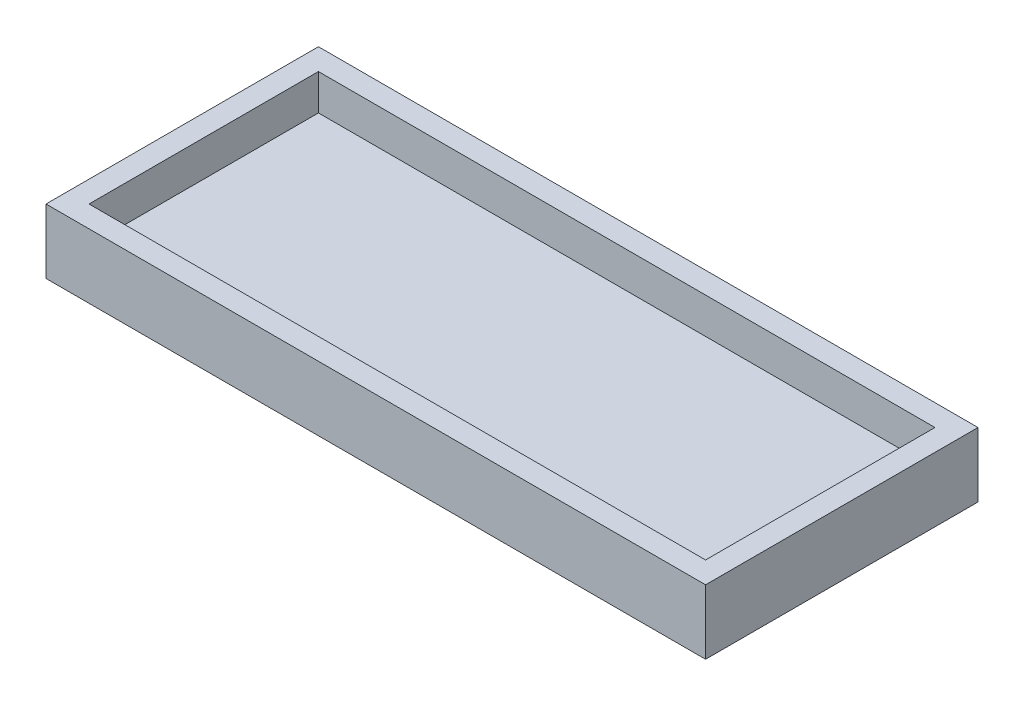
ISO-10303-21;
HEADER;
FILE_DESCRIPTION(('STEP AP214'),'2;1');
FILE_NAME('part.step','',(''),(''),'','','');
FILE_SCHEMA(('AUTOMOTIVE_DESIGN { 1 0 10303 214 1 1 1 1 }'));
ENDSEC;
DATA;
#1=APPLICATION_CONTEXT('core data for automotive mechanical design processes');
#2=APPLICATION_PROTOCOL_DEFINITION('international standard','automotive_design',2000,#1);
#3=PRODUCT_CONTEXT('',#1,'mechanical');
#4=PRODUCT('Part','Part','',(#3));
#5=PRODUCT_RELATED_PRODUCT_CATEGORY('part','',(#4));
#6=PRODUCT_DEFINITION_FORMATION('','',#4);
#7=PRODUCT_DEFINITION_CONTEXT('part definition',#1,'design');
#8=PRODUCT_DEFINITION('design','',#6,#7);
#9=PRODUCT_DEFINITION_SHAPE('','',#8);
#10=(LENGTH_UNIT() NAMED_UNIT(*) SI_UNIT(.MILLI.,.METRE.));
#11=(NAMED_UNIT(*) PLANE_ANGLE_UNIT() SI_UNIT($,.RADIAN.));
#12=(NAMED_UNIT(*) SI_UNIT($,.STERADIAN.) SOLID_ANGLE_UNIT());
#13=UNCERTAINTY_MEASURE_WITH_UNIT(LENGTH_MEASURE(1.E-05),#10,'distance_accuracy_value','');
#14=(GEOMETRIC_REPRESENTATION_CONTEXT(3) GLOBAL_UNCERTAINTY_ASSIGNED_CONTEXT((#13)) GLOBAL_UNIT_ASSIGNED_CONTEXT((#10,
#11,#12)) REPRESENTATION_CONTEXT('',''));
#15=CARTESIAN_POINT('',(0.,0.,0.));
#16=DIRECTION('',(0.,0.,1.));
#17=DIRECTION('',(1.,0.,0.));
#18=AXIS2_PLACEMENT_3D('',#15,#16,#17);
#19=CARTESIAN_POINT('',(0.,2.,0.));
#20=DIRECTION('',(0.,1.,0.));
#21=DIRECTION('',(0.,0.,1.));
#22=AXIS2_PLACEMENT_3D('',#19,#20,#21);
#23=PLANE('',#22);
#24=DIRECTION('',(0.,0.,-1.));
#25=VECTOR('',#24,1.);
#26=CARTESIAN_POINT('',(21.5,2.,-8.));
#27=LINE('',#26,#25);
#28=CARTESIAN_POINT('',(21.5,2.,8.));
#29=VERTEX_POINT('',#28);
#30=CARTESIAN_POINT('',(21.5,2.,-8.));
#31=VERTEX_POINT('',#30);
#32=EDGE_CURVE('E155',#29,#31,#27,.T.);
#33=ORIENTED_EDGE('',*,*,#32,.T.);
#34=DIRECTION('',(-1.,0.,0.));
#35=VECTOR('',#34,1.);
#36=CARTESIAN_POINT('',(-21.5,2.,-8.));
#37=LINE('',#36,#35);
#38=CARTESIAN_POINT('',(-21.5,2.,-8.));
#39=VERTEX_POINT('',#38);
#40=EDGE_CURVE('E102',#31,#39,#37,.T.);
#41=ORIENTED_EDGE('',*,*,#40,.T.);
#42=DIRECTION('',(0.,0.,1.));
#43=VECTOR('',#42,1.);
#44=CARTESIAN_POINT('',(-21.5,2.,-8.));
#45=LINE('',#44,#43);
#46=CARTESIAN_POINT('',(-21.5,2.,8.));
#47=VERTEX_POINT('',#46);
#48=EDGE_CURVE('E41',#39,#47,#45,.T.);
#49=ORIENTED_EDGE('',*,*,#48,.T.);
#50=DIRECTION('',(1.,0.,0.));
#51=VECTOR('',#50,1.);
#52=CARTESIAN_POINT('',(-21.5,2.,8.));
#53=LINE('',#52,#51);
#54=EDGE_CURVE('E11',#47,#29,#53,.T.);
#55=ORIENTED_EDGE('',*,*,#54,.T.);
#56=EDGE_LOOP('',(#33,#41,#49,#55));
#57=FACE_BOUND('',#56,.T.);
#58=ADVANCED_FACE('F33',(#57),#23,.T.);
#59=CARTESIAN_POINT('',(-23.,4.5,-9.5));
#60=DIRECTION('',(0.,0.,-1.));
#61=DIRECTION('',(-1.,0.,0.));
#62=AXIS2_PLACEMENT_3D('',#59,#60,#61);
#63=PLANE('',#62);
#64=DIRECTION('',(1.,0.,0.));
#65=VECTOR('',#64,1.);
#66=CARTESIAN_POINT('',(-23.,0.,-9.5));
#67=LINE('',#66,#65);
#68=CARTESIAN_POINT('',(-23.,0.,-9.5));
#69=VERTEX_POINT('',#68);
#70=CARTESIAN_POINT('',(23.,0.,-9.5));
#71=VERTEX_POINT('',#70);
#72=EDGE_CURVE('E125',#69,#71,#67,.T.);
#73=ORIENTED_EDGE('',*,*,#72,.F.);
#74=DIRECTION('',(0.,-1.,0.));
#75=VECTOR('',#74,1.);
#76=CARTESIAN_POINT('',(-23.,4.5,-9.5));
#77=LINE('',#76,#75);
#78=CARTESIAN_POINT('',(-23.,4.5,-9.5));
#79=VERTEX_POINT('',#78);
#80=EDGE_CURVE('E153',#79,#69,#77,.T.);
#81=ORIENTED_EDGE('',*,*,#80,.F.);
#82=DIRECTION('',(1.,0.,0.));
#83=VECTOR('',#82,1.);
#84=CARTESIAN_POINT('',(-23.,4.5,-9.5));
#85=LINE('',#84,#83);
#86=CARTESIAN_POINT('',(23.,4.5,-9.5));
#87=VERTEX_POINT('',#86);
#88=EDGE_CURVE('E129',#79,#87,#85,.T.);
#89=ORIENTED_EDGE('',*,*,#88,.T.);
#90=DIRECTION('',(0.,-1.,0.));
#91=VECTOR('',#90,1.);
#92=CARTESIAN_POINT('',(23.,4.5,-9.5));
#93=LINE('',#92,#91);
#94=EDGE_CURVE('E142',#87,#71,#93,.T.);
#95=ORIENTED_EDGE('',*,*,#94,.T.);
#96=EDGE_LOOP('',(#73,#81,#89,#95));
#97=FACE_BOUND('',#96,.T.);
#98=ADVANCED_FACE('F175',(#97),#63,.T.);
#99=CARTESIAN_POINT('',(-23.,4.5,9.5));
#100=DIRECTION('',(-1.,0.,0.));
#101=DIRECTION('',(0.,0.,1.));
#102=AXIS2_PLACEMENT_3D('',#99,#100,#101);
#103=PLANE('',#102);
#104=DIRECTION('',(0.,0.,-1.));
#105=VECTOR('',#104,1.);
#106=CARTESIAN_POINT('',(-23.,0.,9.5));
#107=LINE('',#106,#105);
#108=CARTESIAN_POINT('',(-23.,0.,9.5));
#109=VERTEX_POINT('',#108);
#110=EDGE_CURVE('E133',#109,#69,#107,.T.);
#111=ORIENTED_EDGE('',*,*,#110,.F.);
#112=DIRECTION('',(0.,-1.,0.));
#113=VECTOR('',#112,1.);
#114=CARTESIAN_POINT('',(-23.,4.5,9.5));
#115=LINE('',#114,#113);
#116=CARTESIAN_POINT('',(-23.,4.5,9.5));
#117=VERTEX_POINT('',#116);
#118=EDGE_CURVE('E156',#117,#109,#115,.T.);
#119=ORIENTED_EDGE('',*,*,#118,.F.);
#120=DIRECTION('',(0.,0.,-1.));
#121=VECTOR('',#120,1.);
#122=CARTESIAN_POINT('',(-23.,4.5,9.5));
#123=LINE('',#122,#121);
#124=EDGE_CURVE('E139',#117,#79,#123,.T.);
#125=ORIENTED_EDGE('',*,*,#124,.T.);
#126=ORIENTED_EDGE('',*,*,#80,.T.);
#127=EDGE_LOOP('',(#111,#119,#125,#126));
#128=FACE_BOUND('',#127,.T.);
#129=ADVANCED_FACE('F179',(#128),#103,.T.);
#130=CARTESIAN_POINT('',(23.,4.5,9.5));
#131=DIRECTION('',(0.,0.,1.));
#132=DIRECTION('',(1.,0.,0.));
#133=AXIS2_PLACEMENT_3D('',#130,#131,#132);
#134=PLANE('',#133);
#135=DIRECTION('',(-1.,0.,0.));
#136=VECTOR('',#135,1.);
#137=CARTESIAN_POINT('',(23.,0.,9.5));
#138=LINE('',#137,#136);
#139=CARTESIAN_POINT('',(23.,0.,9.5));
#140=VERTEX_POINT('',#139);
#141=EDGE_CURVE('E148',#140,#109,#138,.T.);
#142=ORIENTED_EDGE('',*,*,#141,.F.);
#143=DIRECTION('',(0.,-1.,0.));
#144=VECTOR('',#143,1.);
#145=CARTESIAN_POINT('',(23.,4.5,9.5));
#146=LINE('',#145,#144);
#147=CARTESIAN_POINT('',(23.,4.5,9.5));
#148=VERTEX_POINT('',#147);
#149=EDGE_CURVE('E158',#148,#140,#146,.T.);
#150=ORIENTED_EDGE('',*,*,#149,.F.);
#151=DIRECTION('',(-1.,0.,0.));
#152=VECTOR('',#151,1.);
#153=CARTESIAN_POINT('',(23.,4.5,9.5));
#154=LINE('',#153,#152);
#155=EDGE_CURVE('E136',#148,#117,#154,.T.);
#156=ORIENTED_EDGE('',*,*,#155,.T.);
#157=ORIENTED_EDGE('',*,*,#118,.T.);
#158=EDGE_LOOP('',(#142,#150,#156,#157));
#159=FACE_BOUND('',#158,.T.);
#160=ADVANCED_FACE('F186',(#159),#134,.T.);
#161=CARTESIAN_POINT('',(23.,4.5,-9.5));
#162=DIRECTION('',(1.,0.,0.));
#163=DIRECTION('',(0.,0.,-1.));
#164=AXIS2_PLACEMENT_3D('',#161,#162,#163);
#165=PLANE('',#164);
#166=DIRECTION('',(0.,0.,1.));
#167=VECTOR('',#166,1.);
#168=CARTESIAN_POINT('',(23.,0.,-9.5));
#169=LINE('',#168,#167);
#170=EDGE_CURVE('E145',#71,#140,#169,.T.);
#171=ORIENTED_EDGE('',*,*,#170,.F.);
#172=ORIENTED_EDGE('',*,*,#94,.F.);
#173=DIRECTION('',(0.,0.,1.));
#174=VECTOR('',#173,1.);
#175=CARTESIAN_POINT('',(23.,4.5,-9.5));
#176=LINE('',#175,#174);
#177=EDGE_CURVE('E132',#87,#148,#176,.T.);
#178=ORIENTED_EDGE('',*,*,#177,.T.);
#179=ORIENTED_EDGE('',*,*,#149,.T.);
#180=EDGE_LOOP('',(#171,#172,#178,#179));
#181=FACE_BOUND('',#180,.T.);
#182=ADVANCED_FACE('F183',(#181),#165,.T.);
#183=CARTESIAN_POINT('',(0.,4.5,0.));
#184=DIRECTION('',(0.,-1.,0.));
#185=DIRECTION('',(0.,0.,-1.));
#186=AXIS2_PLACEMENT_3D('',#183,#184,#185);
#187=PLANE('',#186);
#188=DIRECTION('',(0.,0.,-1.));
#189=VECTOR('',#188,1.);
#190=CARTESIAN_POINT('',(-21.5,4.5,8.));
#191=LINE('',#190,#189);
#192=CARTESIAN_POINT('',(-21.5,4.5,8.));
#193=VERTEX_POINT('',#192);
#194=CARTESIAN_POINT('',(-21.5,4.5,-8.));
#195=VERTEX_POINT('',#194);
#196=EDGE_CURVE('E105',#193,#195,#191,.T.);
#197=ORIENTED_EDGE('',*,*,#196,.T.);
#198=DIRECTION('',(1.,0.,0.));
#199=VECTOR('',#198,1.);
#200=CARTESIAN_POINT('',(-21.5,4.5,-8.));
#201=LINE('',#200,#199);
#202=CARTESIAN_POINT('',(21.5,4.5,-8.));
#203=VERTEX_POINT('',#202);
#204=EDGE_CURVE('E99',#195,#203,#201,.T.);
#205=ORIENTED_EDGE('',*,*,#204,.T.);
#206=DIRECTION('',(0.,0.,1.));
#207=VECTOR('',#206,1.);
#208=CARTESIAN_POINT('',(21.5,4.5,-8.));
#209=LINE('',#208,#207);
#210=CARTESIAN_POINT('',(21.5,4.5,8.));
#211=VERTEX_POINT('',#210);
#212=EDGE_CURVE('E109',#203,#211,#209,.T.);
#213=ORIENTED_EDGE('',*,*,#212,.T.);
#214=DIRECTION('',(-1.,0.,0.));
#215=VECTOR('',#214,1.);
#216=CARTESIAN_POINT('',(21.5,4.5,8.));
#217=LINE('',#216,#215);
#218=EDGE_CURVE('E114',#211,#193,#217,.T.);
#219=ORIENTED_EDGE('',*,*,#218,.T.);
#220=EDGE_LOOP('',(#197,#205,#213,#219));
#221=FACE_BOUND('',#220,.T.);
#222=ORIENTED_EDGE('',*,*,#88,.F.);
#223=ORIENTED_EDGE('',*,*,#124,.F.);
#224=ORIENTED_EDGE('',*,*,#155,.F.);
#225=ORIENTED_EDGE('',*,*,#177,.F.);
#226=EDGE_LOOP('',(#222,#223,#224,#225));
#227=FACE_BOUND('',#226,.T.);
#228=ADVANCED_FACE('F116',(#221,#227),#187,.F.);
#229=CARTESIAN_POINT('',(-21.5,4.5,-8.));
#230=DIRECTION('',(0.,0.,-1.));
#231=DIRECTION('',(-1.,0.,0.));
#232=AXIS2_PLACEMENT_3D('',#229,#230,#231);
#233=PLANE('',#232);
#234=ORIENTED_EDGE('',*,*,#40,.F.);
#235=DIRECTION('',(0.,-1.,0.));
#236=VECTOR('',#235,1.);
#237=CARTESIAN_POINT('',(21.5,4.5,-8.));
#238=LINE('',#237,#236);
#239=EDGE_CURVE('E48',#203,#31,#238,.T.);
#240=ORIENTED_EDGE('',*,*,#239,.F.);
#241=ORIENTED_EDGE('',*,*,#204,.F.);
#242=DIRECTION('',(0.,-1.,0.));
#243=VECTOR('',#242,1.);
#244=CARTESIAN_POINT('',(-21.5,4.5,-8.));
#245=LINE('',#244,#243);
#246=EDGE_CURVE('E123',#195,#39,#245,.T.);
#247=ORIENTED_EDGE('',*,*,#246,.T.);
#248=EDGE_LOOP('',(#234,#240,#241,#247));
#249=FACE_BOUND('',#248,.T.);
#250=ADVANCED_FACE('F97',(#249),#233,.F.);
#251=CARTESIAN_POINT('',(-21.5,4.5,8.));
#252=DIRECTION('',(-1.,0.,0.));
#253=DIRECTION('',(0.,0.,1.));
#254=AXIS2_PLACEMENT_3D('',#251,#252,#253);
#255=PLANE('',#254);
#256=ORIENTED_EDGE('',*,*,#48,.F.);
#257=ORIENTED_EDGE('',*,*,#246,.F.);
#258=ORIENTED_EDGE('',*,*,#196,.F.);
#259=DIRECTION('',(0.,-1.,0.));
#260=VECTOR('',#259,1.);
#261=CARTESIAN_POINT('',(-21.5,4.5,8.));
#262=LINE('',#261,#260);
#263=EDGE_CURVE('E126',#193,#47,#262,.T.);
#264=ORIENTED_EDGE('',*,*,#263,.T.);
#265=EDGE_LOOP('',(#256,#257,#258,#264));
#266=FACE_BOUND('',#265,.T.);
#267=ADVANCED_FACE('F165',(#266),#255,.F.);
#268=CARTESIAN_POINT('',(21.5,4.5,8.));
#269=DIRECTION('',(0.,0.,1.));
#270=DIRECTION('',(1.,0.,0.));
#271=AXIS2_PLACEMENT_3D('',#268,#269,#270);
#272=PLANE('',#271);
#273=ORIENTED_EDGE('',*,*,#54,.F.);
#274=ORIENTED_EDGE('',*,*,#263,.F.);
#275=ORIENTED_EDGE('',*,*,#218,.F.);
#276=DIRECTION('',(0.,-1.,0.));
#277=VECTOR('',#276,1.);
#278=CARTESIAN_POINT('',(21.5,4.5,8.));
#279=LINE('',#278,#277);
#280=EDGE_CURVE('E104',#211,#29,#279,.T.);
#281=ORIENTED_EDGE('',*,*,#280,.T.);
#282=EDGE_LOOP('',(#273,#274,#275,#281));
#283=FACE_BOUND('',#282,.T.);
#284=ADVANCED_FACE('F164',(#283),#272,.F.);
#285=CARTESIAN_POINT('',(21.5,4.5,-8.));
#286=DIRECTION('',(1.,0.,0.));
#287=DIRECTION('',(0.,0.,-1.));
#288=AXIS2_PLACEMENT_3D('',#285,#286,#287);
#289=PLANE('',#288);
#290=ORIENTED_EDGE('',*,*,#32,.F.);
#291=ORIENTED_EDGE('',*,*,#280,.F.);
#292=ORIENTED_EDGE('',*,*,#212,.F.);
#293=ORIENTED_EDGE('',*,*,#239,.T.);
#294=EDGE_LOOP('',(#290,#291,#292,#293));
#295=FACE_BOUND('',#294,.T.);
#296=ADVANCED_FACE('F110',(#295),#289,.F.);
#297=CARTESIAN_POINT('',(0.,0.,0.));
#298=DIRECTION('',(0.,1.,0.));
#299=DIRECTION('',(0.,0.,1.));
#300=AXIS2_PLACEMENT_3D('',#297,#298,#299);
#301=PLANE('',#300);
#302=ORIENTED_EDGE('',*,*,#72,.T.);
#303=ORIENTED_EDGE('',*,*,#170,.T.);
#304=ORIENTED_EDGE('',*,*,#141,.T.);
#305=ORIENTED_EDGE('',*,*,#110,.T.);
#306=EDGE_LOOP('',(#302,#303,#304,#305));
#307=FACE_BOUND('',#306,.T.);
#308=ADVANCED_FACE('F35',(#307),#301,.F.);
#309=CLOSED_SHELL('',(#58,#98,#129,#160,#182,#228,#250,#267,#284,#296,#308));
#310=MANIFOLD_SOLID_BREP('B2',#309);
#311=ADVANCED_BREP_SHAPE_REPRESENTATION('',(#18,#310),#14);
#312=SHAPE_DEFINITION_REPRESENTATION(#9,#311);
ENDSEC;
END-ISO-10303-21;
